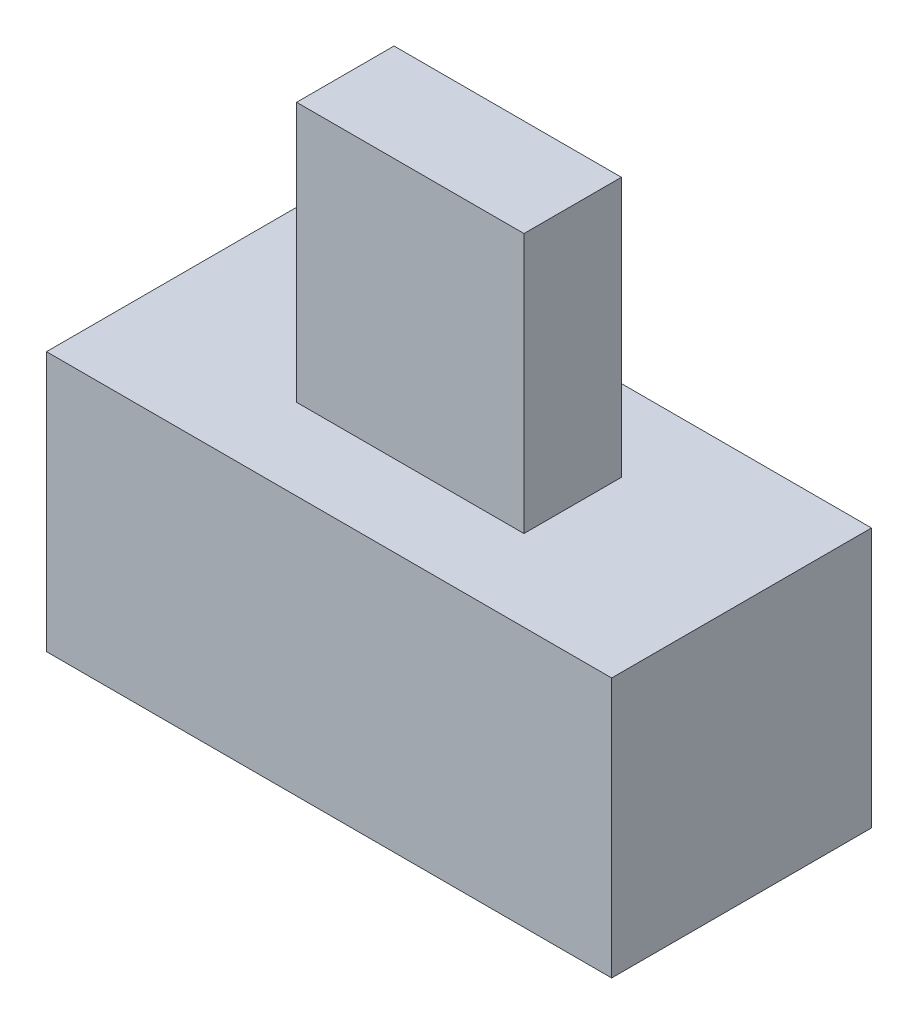
ISO-10303-21;
HEADER;
FILE_DESCRIPTION(('STEP AP214'),'2;1');
FILE_NAME('part.step','',(''),(''),'','','');
FILE_SCHEMA(('AUTOMOTIVE_DESIGN { 1 0 10303 214 1 1 1 1 }'));
ENDSEC;
DATA;
#1=APPLICATION_CONTEXT('core data for automotive mechanical design processes');
#2=APPLICATION_PROTOCOL_DEFINITION('international standard','automotive_design',2000,#1);
#3=PRODUCT_CONTEXT('',#1,'mechanical');
#4=PRODUCT('Part','Part','',(#3));
#5=PRODUCT_RELATED_PRODUCT_CATEGORY('part','',(#4));
#6=PRODUCT_DEFINITION_FORMATION('','',#4);
#7=PRODUCT_DEFINITION_CONTEXT('part definition',#1,'design');
#8=PRODUCT_DEFINITION('design','',#6,#7);
#9=PRODUCT_DEFINITION_SHAPE('','',#8);
#10=(LENGTH_UNIT() NAMED_UNIT(*) SI_UNIT(.MILLI.,.METRE.));
#11=(NAMED_UNIT(*) PLANE_ANGLE_UNIT() SI_UNIT($,.RADIAN.));
#12=(NAMED_UNIT(*) SI_UNIT($,.STERADIAN.) SOLID_ANGLE_UNIT());
#13=UNCERTAINTY_MEASURE_WITH_UNIT(LENGTH_MEASURE(1.E-05),#10,'distance_accuracy_value','');
#14=(GEOMETRIC_REPRESENTATION_CONTEXT(3) GLOBAL_UNCERTAINTY_ASSIGNED_CONTEXT((#13)) GLOBAL_UNIT_ASSIGNED_CONTEXT((#10,
#11,#12)) REPRESENTATION_CONTEXT('',''));
#15=CARTESIAN_POINT('',(0.,0.,0.));
#16=DIRECTION('',(0.,0.,1.));
#17=DIRECTION('',(1.,0.,0.));
#18=AXIS2_PLACEMENT_3D('',#15,#16,#17);
#19=CARTESIAN_POINT('',(0.,4.,0.));
#20=DIRECTION('',(0.,-1.,0.));
#21=DIRECTION('',(0.,0.,-1.));
#22=AXIS2_PLACEMENT_3D('',#19,#20,#21);
#23=PLANE('',#22);
#24=DIRECTION('',(0.,0.,1.));
#25=VECTOR('',#24,1.);
#26=CARTESIAN_POINT('',(0.,4.,0.));
#27=LINE('',#26,#25);
#28=CARTESIAN_POINT('',(0.,4.,-4.));
#29=VERTEX_POINT('',#28);
#30=CARTESIAN_POINT('',(0.,4.,0.));
#31=VERTEX_POINT('',#30);
#32=EDGE_CURVE('E129',#29,#31,#27,.T.);
#33=ORIENTED_EDGE('',*,*,#32,.T.);
#34=DIRECTION('',(1.,0.,0.));
#35=VECTOR('',#34,1.);
#36=CARTESIAN_POINT('',(0.,4.,0.));
#37=LINE('',#36,#35);
#38=CARTESIAN_POINT('',(8.7,4.,0.));
#39=VERTEX_POINT('',#38);
#40=EDGE_CURVE('E132',#31,#39,#37,.T.);
#41=ORIENTED_EDGE('',*,*,#40,.T.);
#42=DIRECTION('',(0.,0.,-1.));
#43=VECTOR('',#42,1.);
#44=CARTESIAN_POINT('',(8.7,4.,0.));
#45=LINE('',#44,#43);
#46=CARTESIAN_POINT('',(8.7,4.,-4.));
#47=VERTEX_POINT('',#46);
#48=EDGE_CURVE('E135',#39,#47,#45,.T.);
#49=ORIENTED_EDGE('',*,*,#48,.T.);
#50=DIRECTION('',(-1.,0.,0.));
#51=VECTOR('',#50,1.);
#52=CARTESIAN_POINT('',(0.,4.,-4.));
#53=LINE('',#52,#51);
#54=EDGE_CURVE('E137',#47,#29,#53,.T.);
#55=ORIENTED_EDGE('',*,*,#54,.T.);
#56=EDGE_LOOP('',(#33,#41,#49,#55));
#57=FACE_BOUND('',#56,.T.);
#58=DIRECTION('',(0.,0.,1.));
#59=VECTOR('',#58,1.);
#60=CARTESIAN_POINT('',(2.6,4.,-2.75));
#61=LINE('',#60,#59);
#62=CARTESIAN_POINT('',(2.6,4.,-2.75));
#63=VERTEX_POINT('',#62);
#64=CARTESIAN_POINT('',(2.6,4.,-1.25));
#65=VERTEX_POINT('',#64);
#66=EDGE_CURVE('E50',#63,#65,#61,.T.);
#67=ORIENTED_EDGE('',*,*,#66,.F.);
#68=DIRECTION('',(-1.,0.,0.));
#69=VECTOR('',#68,1.);
#70=CARTESIAN_POINT('',(2.6,4.,-2.75));
#71=LINE('',#70,#69);
#72=CARTESIAN_POINT('',(6.1,4.,-2.75));
#73=VERTEX_POINT('',#72);
#74=EDGE_CURVE('E54',#73,#63,#71,.T.);
#75=ORIENTED_EDGE('',*,*,#74,.F.);
#76=DIRECTION('',(0.,0.,-1.));
#77=VECTOR('',#76,1.);
#78=CARTESIAN_POINT('',(6.1,4.,-2.75));
#79=LINE('',#78,#77);
#80=CARTESIAN_POINT('',(6.1,4.,-1.25));
#81=VERTEX_POINT('',#80);
#82=EDGE_CURVE('E262',#81,#73,#79,.T.);
#83=ORIENTED_EDGE('',*,*,#82,.F.);
#84=DIRECTION('',(1.,0.,0.));
#85=VECTOR('',#84,1.);
#86=CARTESIAN_POINT('',(2.6,4.,-1.25));
#87=LINE('',#86,#85);
#88=EDGE_CURVE('E268',#65,#81,#87,.T.);
#89=ORIENTED_EDGE('',*,*,#88,.F.);
#90=EDGE_LOOP('',(#67,#75,#83,#89));
#91=FACE_BOUND('',#90,.T.);
#92=ADVANCED_FACE('F35',(#57,#91),#23,.F.);
#93=CARTESIAN_POINT('',(0.,4.,0.));
#94=DIRECTION('',(1.,0.,0.));
#95=DIRECTION('',(0.,0.,-1.));
#96=AXIS2_PLACEMENT_3D('',#93,#94,#95);
#97=PLANE('',#96);
#98=DIRECTION('',(0.,0.,1.));
#99=VECTOR('',#98,1.);
#100=CARTESIAN_POINT('',(0.,0.,0.));
#101=LINE('',#100,#99);
#102=CARTESIAN_POINT('',(0.,0.,-4.));
#103=VERTEX_POINT('',#102);
#104=CARTESIAN_POINT('',(0.,0.,0.));
#105=VERTEX_POINT('',#104);
#106=EDGE_CURVE('E120',#103,#105,#101,.T.);
#107=ORIENTED_EDGE('',*,*,#106,.T.);
#108=DIRECTION('',(0.,-1.,0.));
#109=VECTOR('',#108,1.);
#110=CARTESIAN_POINT('',(0.,4.,0.));
#111=LINE('',#110,#109);
#112=EDGE_CURVE('E11',#31,#105,#111,.T.);
#113=ORIENTED_EDGE('',*,*,#112,.F.);
#114=ORIENTED_EDGE('',*,*,#32,.F.);
#115=DIRECTION('',(0.,-1.,0.));
#116=VECTOR('',#115,1.);
#117=CARTESIAN_POINT('',(0.,4.,-4.));
#118=LINE('',#117,#116);
#119=EDGE_CURVE('E138',#29,#103,#118,.T.);
#120=ORIENTED_EDGE('',*,*,#119,.T.);
#121=EDGE_LOOP('',(#107,#113,#114,#120));
#122=FACE_BOUND('',#121,.T.);
#123=ADVANCED_FACE('F37',(#122),#97,.F.);
#124=CARTESIAN_POINT('',(0.,4.,0.));
#125=DIRECTION('',(0.,0.,-1.));
#126=DIRECTION('',(-1.,0.,0.));
#127=AXIS2_PLACEMENT_3D('',#124,#125,#126);
#128=PLANE('',#127);
#129=DIRECTION('',(1.,0.,0.));
#130=VECTOR('',#129,1.);
#131=CARTESIAN_POINT('',(0.,0.,0.));
#132=LINE('',#131,#130);
#133=CARTESIAN_POINT('',(8.7,0.,0.));
#134=VERTEX_POINT('',#133);
#135=EDGE_CURVE('E123',#105,#134,#132,.T.);
#136=ORIENTED_EDGE('',*,*,#135,.T.);
#137=DIRECTION('',(0.,-1.,0.));
#138=VECTOR('',#137,1.);
#139=CARTESIAN_POINT('',(8.7,4.,0.));
#140=LINE('',#139,#138);
#141=EDGE_CURVE('E43',#39,#134,#140,.T.);
#142=ORIENTED_EDGE('',*,*,#141,.F.);
#143=ORIENTED_EDGE('',*,*,#40,.F.);
#144=ORIENTED_EDGE('',*,*,#112,.T.);
#145=EDGE_LOOP('',(#136,#142,#143,#144));
#146=FACE_BOUND('',#145,.T.);
#147=ADVANCED_FACE('F168',(#146),#128,.F.);
#148=CARTESIAN_POINT('',(8.7,4.,0.));
#149=DIRECTION('',(-1.,0.,0.));
#150=DIRECTION('',(0.,0.,1.));
#151=AXIS2_PLACEMENT_3D('',#148,#149,#150);
#152=PLANE('',#151);
#153=DIRECTION('',(0.,0.,-1.));
#154=VECTOR('',#153,1.);
#155=CARTESIAN_POINT('',(8.7,0.,0.));
#156=LINE('',#155,#154);
#157=CARTESIAN_POINT('',(8.7,0.,-4.));
#158=VERTEX_POINT('',#157);
#159=EDGE_CURVE('E141',#134,#158,#156,.T.);
#160=ORIENTED_EDGE('',*,*,#159,.T.);
#161=DIRECTION('',(0.,-1.,0.));
#162=VECTOR('',#161,1.);
#163=CARTESIAN_POINT('',(8.7,4.,-4.));
#164=LINE('',#163,#162);
#165=EDGE_CURVE('E146',#47,#158,#164,.T.);
#166=ORIENTED_EDGE('',*,*,#165,.F.);
#167=ORIENTED_EDGE('',*,*,#48,.F.);
#168=ORIENTED_EDGE('',*,*,#141,.T.);
#169=EDGE_LOOP('',(#160,#166,#167,#168));
#170=FACE_BOUND('',#169,.T.);
#171=ADVANCED_FACE('F153',(#170),#152,.F.);
#172=CARTESIAN_POINT('',(0.,4.,-4.));
#173=DIRECTION('',(0.,0.,1.));
#174=DIRECTION('',(1.,0.,0.));
#175=AXIS2_PLACEMENT_3D('',#172,#173,#174);
#176=PLANE('',#175);
#177=DIRECTION('',(-1.,0.,0.));
#178=VECTOR('',#177,1.);
#179=CARTESIAN_POINT('',(0.,0.,-4.));
#180=LINE('',#179,#178);
#181=EDGE_CURVE('E133',#158,#103,#180,.T.);
#182=ORIENTED_EDGE('',*,*,#181,.T.);
#183=ORIENTED_EDGE('',*,*,#119,.F.);
#184=ORIENTED_EDGE('',*,*,#54,.F.);
#185=ORIENTED_EDGE('',*,*,#165,.T.);
#186=EDGE_LOOP('',(#182,#183,#184,#185));
#187=FACE_BOUND('',#186,.T.);
#188=ADVANCED_FACE('F162',(#187),#176,.F.);
#189=CARTESIAN_POINT('',(0.,0.,0.));
#190=DIRECTION('',(0.,-1.,0.));
#191=DIRECTION('',(0.,0.,-1.));
#192=AXIS2_PLACEMENT_3D('',#189,#190,#191);
#193=PLANE('',#192);
#194=ORIENTED_EDGE('',*,*,#106,.F.);
#195=ORIENTED_EDGE('',*,*,#181,.F.);
#196=ORIENTED_EDGE('',*,*,#159,.F.);
#197=ORIENTED_EDGE('',*,*,#135,.F.);
#198=EDGE_LOOP('',(#194,#195,#196,#197));
#199=FACE_BOUND('',#198,.T.);
#200=ADVANCED_FACE('F159',(#199),#193,.T.);
#201=CARTESIAN_POINT('',(2.6,8.,-2.75));
#202=DIRECTION('',(1.,0.,0.));
#203=DIRECTION('',(0.,0.,-1.));
#204=AXIS2_PLACEMENT_3D('',#201,#202,#203);
#205=PLANE('',#204);
#206=ORIENTED_EDGE('',*,*,#66,.T.);
#207=DIRECTION('',(0.,-1.,0.));
#208=VECTOR('',#207,1.);
#209=CARTESIAN_POINT('',(2.6,8.,-1.25));
#210=LINE('',#209,#208);
#211=CARTESIAN_POINT('',(2.6,8.,-1.25));
#212=VERTEX_POINT('',#211);
#213=EDGE_CURVE('E103',#212,#65,#210,.T.);
#214=ORIENTED_EDGE('',*,*,#213,.F.);
#215=DIRECTION('',(0.,0.,1.));
#216=VECTOR('',#215,1.);
#217=CARTESIAN_POINT('',(2.6,8.,-2.75));
#218=LINE('',#217,#216);
#219=CARTESIAN_POINT('',(2.6,8.,-2.75));
#220=VERTEX_POINT('',#219);
#221=EDGE_CURVE('E109',#220,#212,#218,.T.);
#222=ORIENTED_EDGE('',*,*,#221,.F.);
#223=DIRECTION('',(0.,-1.,0.));
#224=VECTOR('',#223,1.);
#225=CARTESIAN_POINT('',(2.6,8.,-2.75));
#226=LINE('',#225,#224);
#227=EDGE_CURVE('E260',#220,#63,#226,.T.);
#228=ORIENTED_EDGE('',*,*,#227,.T.);
#229=EDGE_LOOP('',(#206,#214,#222,#228));
#230=FACE_BOUND('',#229,.T.);
#231=ADVANCED_FACE('F119',(#230),#205,.F.);
#232=CARTESIAN_POINT('',(2.6,8.,-1.25));
#233=DIRECTION('',(0.,0.,-1.));
#234=DIRECTION('',(-1.,0.,0.));
#235=AXIS2_PLACEMENT_3D('',#232,#233,#234);
#236=PLANE('',#235);
#237=ORIENTED_EDGE('',*,*,#88,.T.);
#238=DIRECTION('',(0.,-1.,0.));
#239=VECTOR('',#238,1.);
#240=CARTESIAN_POINT('',(6.1,8.,-1.25));
#241=LINE('',#240,#239);
#242=CARTESIAN_POINT('',(6.1,8.,-1.25));
#243=VERTEX_POINT('',#242);
#244=EDGE_CURVE('E105',#243,#81,#241,.T.);
#245=ORIENTED_EDGE('',*,*,#244,.F.);
#246=DIRECTION('',(1.,0.,0.));
#247=VECTOR('',#246,1.);
#248=CARTESIAN_POINT('',(2.6,8.,-1.25));
#249=LINE('',#248,#247);
#250=EDGE_CURVE('E98',#212,#243,#249,.T.);
#251=ORIENTED_EDGE('',*,*,#250,.F.);
#252=ORIENTED_EDGE('',*,*,#213,.T.);
#253=EDGE_LOOP('',(#237,#245,#251,#252));
#254=FACE_BOUND('',#253,.T.);
#255=ADVANCED_FACE('F101',(#254),#236,.F.);
#256=CARTESIAN_POINT('',(6.1,8.,-2.75));
#257=DIRECTION('',(-1.,0.,0.));
#258=DIRECTION('',(0.,0.,1.));
#259=AXIS2_PLACEMENT_3D('',#256,#257,#258);
#260=PLANE('',#259);
#261=ORIENTED_EDGE('',*,*,#82,.T.);
#262=DIRECTION('',(0.,-1.,0.));
#263=VECTOR('',#262,1.);
#264=CARTESIAN_POINT('',(6.1,8.,-2.75));
#265=LINE('',#264,#263);
#266=CARTESIAN_POINT('',(6.1,8.,-2.75));
#267=VERTEX_POINT('',#266);
#268=EDGE_CURVE('E125',#267,#73,#265,.T.);
#269=ORIENTED_EDGE('',*,*,#268,.F.);
#270=DIRECTION('',(0.,0.,-1.));
#271=VECTOR('',#270,1.);
#272=CARTESIAN_POINT('',(6.1,8.,-2.75));
#273=LINE('',#272,#271);
#274=EDGE_CURVE('E108',#243,#267,#273,.T.);
#275=ORIENTED_EDGE('',*,*,#274,.F.);
#276=ORIENTED_EDGE('',*,*,#244,.T.);
#277=EDGE_LOOP('',(#261,#269,#275,#276));
#278=FACE_BOUND('',#277,.T.);
#279=ADVANCED_FACE('F204',(#278),#260,.F.);
#280=CARTESIAN_POINT('',(2.6,8.,-2.75));
#281=DIRECTION('',(0.,0.,1.));
#282=DIRECTION('',(1.,0.,0.));
#283=AXIS2_PLACEMENT_3D('',#280,#281,#282);
#284=PLANE('',#283);
#285=ORIENTED_EDGE('',*,*,#74,.T.);
#286=ORIENTED_EDGE('',*,*,#227,.F.);
#287=DIRECTION('',(-1.,0.,0.));
#288=VECTOR('',#287,1.);
#289=CARTESIAN_POINT('',(2.6,8.,-2.75));
#290=LINE('',#289,#288);
#291=EDGE_CURVE('E114',#267,#220,#290,.T.);
#292=ORIENTED_EDGE('',*,*,#291,.F.);
#293=ORIENTED_EDGE('',*,*,#268,.T.);
#294=EDGE_LOOP('',(#285,#286,#292,#293));
#295=FACE_BOUND('',#294,.T.);
#296=ADVANCED_FACE('F210',(#295),#284,.F.);
#297=CARTESIAN_POINT('',(0.,8.,0.));
#298=DIRECTION('',(0.,1.,0.));
#299=DIRECTION('',(0.,0.,1.));
#300=AXIS2_PLACEMENT_3D('',#297,#298,#299);
#301=PLANE('',#300);
#302=ORIENTED_EDGE('',*,*,#221,.T.);
#303=ORIENTED_EDGE('',*,*,#250,.T.);
#304=ORIENTED_EDGE('',*,*,#274,.T.);
#305=ORIENTED_EDGE('',*,*,#291,.T.);
#306=EDGE_LOOP('',(#302,#303,#304,#305));
#307=FACE_BOUND('',#306,.T.);
#308=ADVANCED_FACE('F112',(#307),#301,.T.);
#309=CLOSED_SHELL('',(#92,#123,#147,#171,#188,#200,#231,#255,#279,#296,#308));
#310=MANIFOLD_SOLID_BREP('B2',#309);
#311=ADVANCED_BREP_SHAPE_REPRESENTATION('',(#18,#310),#14);
#312=SHAPE_DEFINITION_REPRESENTATION(#9,#311);
ENDSEC;
END-ISO-10303-21;
